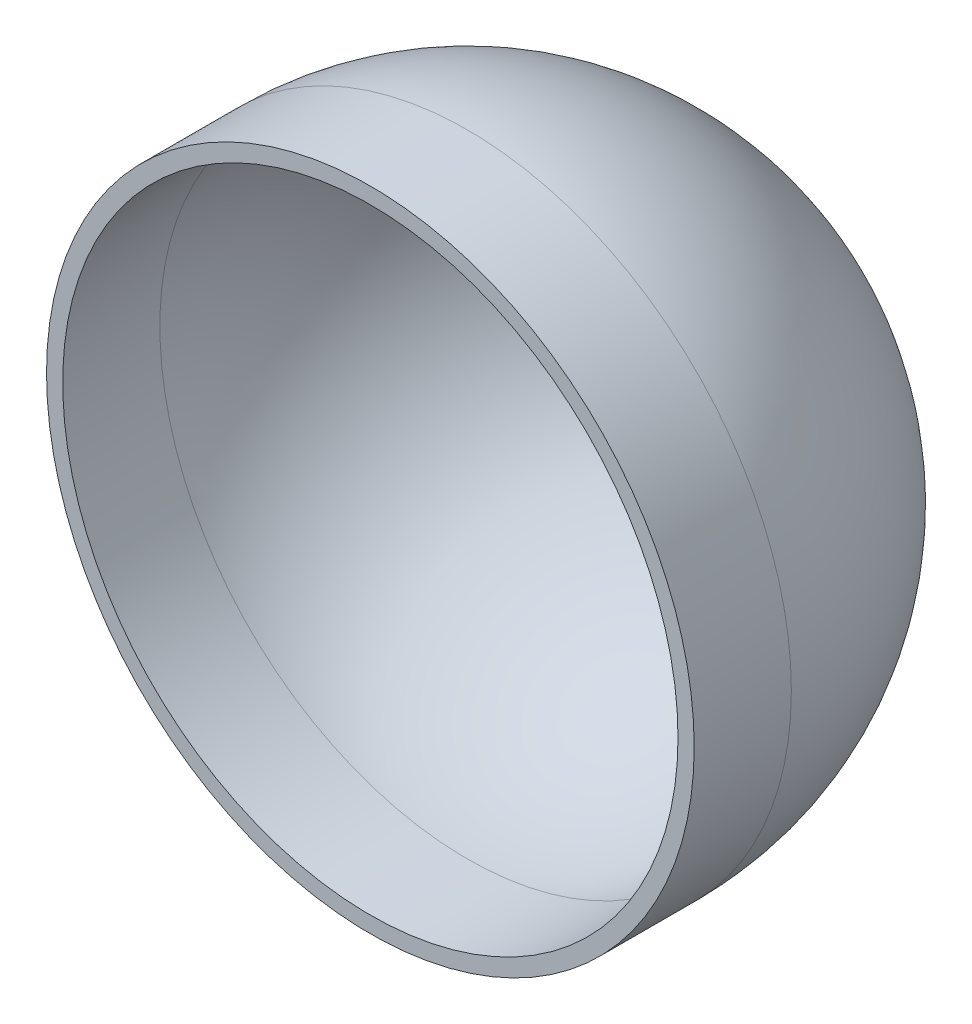
ISO-10303-21;
HEADER;
FILE_DESCRIPTION(('STEP AP214'),'2;1');
FILE_NAME('part.step','',(''),(''),'','','');
FILE_SCHEMA(('AUTOMOTIVE_DESIGN { 1 0 10303 214 1 1 1 1 }'));
ENDSEC;
DATA;
#1=APPLICATION_CONTEXT('core data for automotive mechanical design processes');
#2=APPLICATION_PROTOCOL_DEFINITION('international standard','automotive_design',2000,#1);
#3=PRODUCT_CONTEXT('',#1,'mechanical');
#4=PRODUCT('Part','Part','',(#3));
#5=PRODUCT_RELATED_PRODUCT_CATEGORY('part','',(#4));
#6=PRODUCT_DEFINITION_FORMATION('','',#4);
#7=PRODUCT_DEFINITION_CONTEXT('part definition',#1,'design');
#8=PRODUCT_DEFINITION('design','',#6,#7);
#9=PRODUCT_DEFINITION_SHAPE('','',#8);
#10=(LENGTH_UNIT() NAMED_UNIT(*) SI_UNIT(.MILLI.,.METRE.));
#11=(NAMED_UNIT(*) PLANE_ANGLE_UNIT() SI_UNIT($,.RADIAN.));
#12=(NAMED_UNIT(*) SI_UNIT($,.STERADIAN.) SOLID_ANGLE_UNIT());
#13=UNCERTAINTY_MEASURE_WITH_UNIT(LENGTH_MEASURE(1.E-05),#10,'distance_accuracy_value','');
#14=(GEOMETRIC_REPRESENTATION_CONTEXT(3) GLOBAL_UNCERTAINTY_ASSIGNED_CONTEXT((#13)) GLOBAL_UNIT_ASSIGNED_CONTEXT((#10,
#11,#12)) REPRESENTATION_CONTEXT('',''));
#15=CARTESIAN_POINT('',(0.,0.,0.));
#16=DIRECTION('',(0.,0.,1.));
#17=DIRECTION('',(1.,0.,0.));
#18=AXIS2_PLACEMENT_3D('',#15,#16,#17);
#19=CARTESIAN_POINT('',(0.,0.,0.));
#20=DIRECTION('',(0.,0.,1.));
#21=DIRECTION('',(1.,0.,0.));
#22=AXIS2_PLACEMENT_3D('',#19,#20,#21);
#23=SPHERICAL_SURFACE('',#22,100.);
#24=CARTESIAN_POINT('',(3.591000312264E-13,0.,3.7470027081099E-13));
#25=DIRECTION('',(0.,0.,1.));
#26=DIRECTION('',(1.,0.,0.));
#27=AXIS2_PLACEMENT_3D('',#24,#25,#26);
#28=CIRCLE('',#27,99.9999999999996);
#29=CARTESIAN_POINT('',(100.,0.,0.));
#30=VERTEX_POINT('',#29);
#31=EDGE_CURVE('E10',#30,#30,#28,.T.);
#32=ORIENTED_EDGE('',*,*,#31,.F.);
#33=EDGE_LOOP('',(#32));
#34=FACE_BOUND('',#33,.T.);
#35=ADVANCED_FACE('F40',(#34),#23,.T.);
#36=CARTESIAN_POINT('',(0.,0.,30.));
#37=DIRECTION('',(0.,0.,1.));
#38=DIRECTION('',(1.,0.,0.));
#39=AXIS2_PLACEMENT_3D('',#36,#37,#38);
#40=PLANE('',#39);
#41=CARTESIAN_POINT('',(0.,0.,30.));
#42=DIRECTION('',(0.,0.,1.));
#43=DIRECTION('',(1.,0.,0.));
#44=AXIS2_PLACEMENT_3D('',#41,#42,#43);
#45=CIRCLE('',#44,100.);
#46=CARTESIAN_POINT('',(100.,0.,30.));
#47=VERTEX_POINT('',#46);
#48=EDGE_CURVE('E47',#47,#47,#45,.T.);
#49=ORIENTED_EDGE('',*,*,#48,.T.);
#50=EDGE_LOOP('',(#49));
#51=FACE_BOUND('',#50,.T.);
#52=CARTESIAN_POINT('',(0.,0.,30.));
#53=DIRECTION('',(0.,0.,1.));
#54=DIRECTION('',(1.,0.,0.));
#55=AXIS2_PLACEMENT_3D('',#52,#53,#54);
#56=CIRCLE('',#55,95.);
#57=CARTESIAN_POINT('',(95.,0.,30.));
#58=VERTEX_POINT('',#57);
#59=EDGE_CURVE('E52',#58,#58,#56,.T.);
#60=ORIENTED_EDGE('',*,*,#59,.F.);
#61=EDGE_LOOP('',(#60));
#62=FACE_BOUND('',#61,.T.);
#63=ADVANCED_FACE('F75',(#51,#62),#40,.T.);
#64=CARTESIAN_POINT('',(0.,0.,30.));
#65=DIRECTION('',(0.,0.,-1.));
#66=DIRECTION('',(-1.,0.,0.));
#67=AXIS2_PLACEMENT_3D('',#64,#65,#66);
#68=CYLINDRICAL_SURFACE('',#67,100.);
#69=ORIENTED_EDGE('',*,*,#48,.F.);
#70=EDGE_LOOP('',(#69));
#71=FACE_BOUND('',#70,.T.);
#72=ORIENTED_EDGE('',*,*,#31,.T.);
#73=EDGE_LOOP('',(#72));
#74=FACE_BOUND('',#73,.T.);
#75=ADVANCED_FACE('F68',(#71,#74),#68,.T.);
#76=CARTESIAN_POINT('',(0.,0.,30.));
#77=DIRECTION('',(0.,0.,-1.));
#78=DIRECTION('',(-1.,0.,0.));
#79=AXIS2_PLACEMENT_3D('',#76,#77,#78);
#80=CYLINDRICAL_SURFACE('',#79,95.);
#81=ORIENTED_EDGE('',*,*,#59,.T.);
#82=EDGE_LOOP('',(#81));
#83=FACE_BOUND('',#82,.T.);
#84=CARTESIAN_POINT('',(0.,0.,0.));
#85=DIRECTION('',(0.,0.,1.));
#86=DIRECTION('',(1.,0.,0.));
#87=AXIS2_PLACEMENT_3D('',#84,#85,#86);
#88=CIRCLE('',#87,95.);
#89=CARTESIAN_POINT('',(95.,0.,0.));
#90=VERTEX_POINT('',#89);
#91=EDGE_CURVE('E57',#90,#90,#88,.T.);
#92=ORIENTED_EDGE('',*,*,#91,.F.);
#93=EDGE_LOOP('',(#92));
#94=FACE_BOUND('',#93,.T.);
#95=ADVANCED_FACE('F66',(#83,#94),#80,.F.);
#96=CARTESIAN_POINT('',(0.,0.,0.));
#97=DIRECTION('',(0.,0.,1.));
#98=DIRECTION('',(1.,0.,0.));
#99=AXIS2_PLACEMENT_3D('',#96,#97,#98);
#100=SPHERICAL_SURFACE('',#99,95.);
#101=ORIENTED_EDGE('',*,*,#91,.T.);
#102=EDGE_LOOP('',(#101));
#103=FACE_BOUND('',#102,.T.);
#104=ADVANCED_FACE('F64',(#103),#100,.F.);
#105=CLOSED_SHELL('',(#35,#63,#75,#95,#104));
#106=MANIFOLD_SOLID_BREP('B2',#105);
#107=ADVANCED_BREP_SHAPE_REPRESENTATION('',(#18,#106),#14);
#108=SHAPE_DEFINITION_REPRESENTATION(#9,#107);
ENDSEC;
END-ISO-10303-21;
